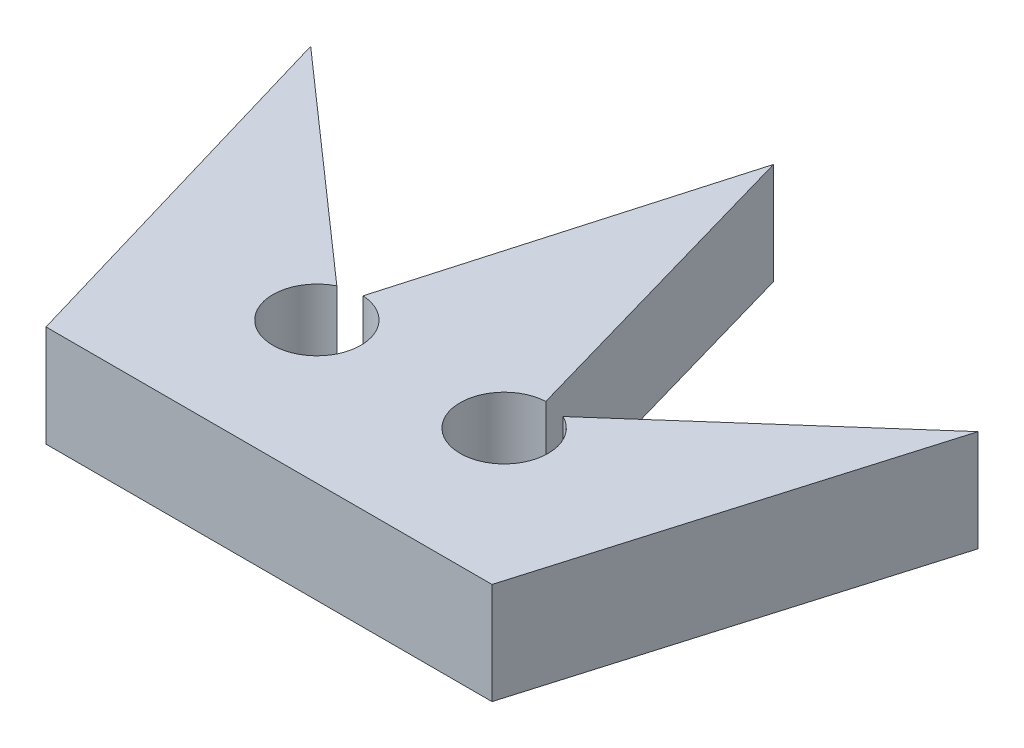
ISO-10303-21;
HEADER;
FILE_DESCRIPTION(('STEP AP214'),'2;1');
FILE_NAME('part.step','',(''),(''),'','','');
FILE_SCHEMA(('AUTOMOTIVE_DESIGN { 1 0 10303 214 1 1 1 1 }'));
ENDSEC;
DATA;
#1=APPLICATION_CONTEXT('core data for automotive mechanical design processes');
#2=APPLICATION_PROTOCOL_DEFINITION('international standard','automotive_design',2000,#1);
#3=PRODUCT_CONTEXT('',#1,'mechanical');
#4=PRODUCT('Part','Part','',(#3));
#5=PRODUCT_RELATED_PRODUCT_CATEGORY('part','',(#4));
#6=PRODUCT_DEFINITION_FORMATION('','',#4);
#7=PRODUCT_DEFINITION_CONTEXT('part definition',#1,'design');
#8=PRODUCT_DEFINITION('design','',#6,#7);
#9=PRODUCT_DEFINITION_SHAPE('','',#8);
#10=(LENGTH_UNIT() NAMED_UNIT(*) SI_UNIT(.MILLI.,.METRE.));
#11=(NAMED_UNIT(*) PLANE_ANGLE_UNIT() SI_UNIT($,.RADIAN.));
#12=(NAMED_UNIT(*) SI_UNIT($,.STERADIAN.) SOLID_ANGLE_UNIT());
#13=UNCERTAINTY_MEASURE_WITH_UNIT(LENGTH_MEASURE(1.E-05),#10,'distance_accuracy_value','');
#14=(GEOMETRIC_REPRESENTATION_CONTEXT(3) GLOBAL_UNCERTAINTY_ASSIGNED_CONTEXT((#13)) GLOBAL_UNIT_ASSIGNED_CONTEXT((#10,
#11,#12)) REPRESENTATION_CONTEXT('',''));
#15=CARTESIAN_POINT('',(0.,0.,0.));
#16=DIRECTION('',(0.,0.,1.));
#17=DIRECTION('',(1.,0.,0.));
#18=AXIS2_PLACEMENT_3D('',#15,#16,#17);
#19=CARTESIAN_POINT('',(-41.4211907266411,17.145,42.8132028356834));
#20=DIRECTION('',(0.959182747675302,0.,-0.28278694552977));
#21=DIRECTION('',(-0.282786945529771,0.,-0.959182747675302));
#22=AXIS2_PLACEMENT_3D('',#19,#20,#21);
#23=PLANE('',#22);
#24=DIRECTION('',(0.282786945529771,0.,0.959182747675302));
#25=VECTOR('',#24,1.);
#26=CARTESIAN_POINT('',(-41.4211907266411,-3.429,42.8132028356834));
#27=LINE('',#26,#25);
#28=CARTESIAN_POINT('',(-63.8484997023004,-3.429,-33.2578046358095));
#29=VERTEX_POINT('',#28);
#30=CARTESIAN_POINT('',(-41.4211907266411,-3.429,42.8132028356834));
#31=VERTEX_POINT('',#30);
#32=EDGE_CURVE('E152',#29,#31,#27,.T.);
#33=ORIENTED_EDGE('',*,*,#32,.T.);
#34=DIRECTION('',(0.,-1.,0.));
#35=VECTOR('',#34,1.);
#36=CARTESIAN_POINT('',(-41.4211907266411,17.145,42.8132028356834));
#37=LINE('',#36,#35);
#38=CARTESIAN_POINT('',(-41.4211907266411,17.145,42.8132028356834));
#39=VERTEX_POINT('',#38);
#40=EDGE_CURVE('E12',#39,#31,#37,.T.);
#41=ORIENTED_EDGE('',*,*,#40,.F.);
#42=DIRECTION('',(0.282786945529771,0.,0.959182747675302));
#43=VECTOR('',#42,1.);
#44=CARTESIAN_POINT('',(-41.4211907266411,17.145,42.8132028356834));
#45=LINE('',#44,#43);
#46=CARTESIAN_POINT('',(-63.8484997023004,17.145,-33.2578046358095));
#47=VERTEX_POINT('',#46);
#48=EDGE_CURVE('E177',#47,#39,#45,.T.);
#49=ORIENTED_EDGE('',*,*,#48,.F.);
#50=DIRECTION('',(0.,-1.,0.));
#51=VECTOR('',#50,1.);
#52=CARTESIAN_POINT('',(-63.8484997023004,17.145,-33.2578046358095));
#53=LINE('',#52,#51);
#54=EDGE_CURVE('E148',#47,#29,#53,.T.);
#55=ORIENTED_EDGE('',*,*,#54,.T.);
#56=EDGE_LOOP('',(#33,#41,#49,#55));
#57=FACE_BOUND('',#56,.T.);
#58=ADVANCED_FACE('F45',(#57),#23,.F.);
#59=CARTESIAN_POINT('',(48.9780188827693,17.145,42.8132028356834));
#60=DIRECTION('',(0.,0.,-1.));
#61=DIRECTION('',(-1.,0.,0.));
#62=AXIS2_PLACEMENT_3D('',#59,#60,#61);
#63=PLANE('',#62);
#64=DIRECTION('',(1.,0.,0.));
#65=VECTOR('',#64,1.);
#66=CARTESIAN_POINT('',(48.9780188827693,-3.429,42.8132028356834));
#67=LINE('',#66,#65);
#68=CARTESIAN_POINT('',(48.9780188827693,-3.429,42.8132028356834));
#69=VERTEX_POINT('',#68);
#70=EDGE_CURVE('E156',#31,#69,#67,.T.);
#71=ORIENTED_EDGE('',*,*,#70,.T.);
#72=DIRECTION('',(0.,-1.,0.));
#73=VECTOR('',#72,1.);
#74=CARTESIAN_POINT('',(48.9780188827693,17.145,42.8132028356834));
#75=LINE('',#74,#73);
#76=CARTESIAN_POINT('',(48.9780188827693,17.145,42.8132028356834));
#77=VERTEX_POINT('',#76);
#78=EDGE_CURVE('E54',#77,#69,#75,.T.);
#79=ORIENTED_EDGE('',*,*,#78,.F.);
#80=DIRECTION('',(1.,0.,0.));
#81=VECTOR('',#80,1.);
#82=CARTESIAN_POINT('',(48.9780188827693,17.145,42.8132028356834));
#83=LINE('',#82,#81);
#84=EDGE_CURVE('E108',#39,#77,#83,.T.);
#85=ORIENTED_EDGE('',*,*,#84,.F.);
#86=ORIENTED_EDGE('',*,*,#40,.T.);
#87=EDGE_LOOP('',(#71,#79,#85,#86));
#88=FACE_BOUND('',#87,.T.);
#89=ADVANCED_FACE('F233',(#88),#63,.F.);
#90=CARTESIAN_POINT('',(48.9780188827693,17.145,42.8132028356834));
#91=DIRECTION('',(-0.959182747675302,0.,-0.28278694552977));
#92=DIRECTION('',(-0.282786945529771,0.,0.959182747675302));
#93=AXIS2_PLACEMENT_3D('',#90,#91,#92);
#94=PLANE('',#93);
#95=DIRECTION('',(0.282786945529771,0.,-0.959182747675302));
#96=VECTOR('',#95,1.);
#97=CARTESIAN_POINT('',(48.9780188827693,-3.429,42.8132028356834));
#98=LINE('',#97,#96);
#99=CARTESIAN_POINT('',(71.4053278584285,-3.429,-33.2578046358095));
#100=VERTEX_POINT('',#99);
#101=EDGE_CURVE('E159',#69,#100,#98,.T.);
#102=ORIENTED_EDGE('',*,*,#101,.T.);
#103=DIRECTION('',(0.,-1.,0.));
#104=VECTOR('',#103,1.);
#105=CARTESIAN_POINT('',(71.4053278584285,17.145,-33.2578046358095));
#106=LINE('',#105,#104);
#107=CARTESIAN_POINT('',(71.4053278584285,17.145,-33.2578046358095));
#108=VERTEX_POINT('',#107);
#109=EDGE_CURVE('E192',#108,#100,#106,.T.);
#110=ORIENTED_EDGE('',*,*,#109,.F.);
#111=DIRECTION('',(0.282786945529771,0.,-0.959182747675302));
#112=VECTOR('',#111,1.);
#113=CARTESIAN_POINT('',(48.9780188827693,17.145,42.8132028356834));
#114=LINE('',#113,#112);
#115=EDGE_CURVE('E202',#77,#108,#114,.T.);
#116=ORIENTED_EDGE('',*,*,#115,.F.);
#117=ORIENTED_EDGE('',*,*,#78,.T.);
#118=EDGE_LOOP('',(#102,#110,#116,#117));
#119=FACE_BOUND('',#118,.T.);
#120=ADVANCED_FACE('F200',(#119),#94,.F.);
#121=CARTESIAN_POINT('',(71.4053278584285,17.145,-33.2578046358095));
#122=DIRECTION('',(0.661200984662022,0.,0.750208809520371));
#123=DIRECTION('',(0.750208809520371,0.,-0.661200984662022));
#124=AXIS2_PLACEMENT_3D('',#121,#122,#123);
#125=PLANE('',#124);
#126=DIRECTION('',(-0.750208809520371,0.,0.661200984662022));
#127=VECTOR('',#126,1.);
#128=CARTESIAN_POINT('',(71.4053278584285,-3.429,-33.2578046358095));
#129=LINE('',#128,#127);
#130=CARTESIAN_POINT('',(26.7022457785671,-3.429,6.14152194305134));
#131=VERTEX_POINT('',#130);
#132=EDGE_CURVE('E162',#100,#131,#129,.T.);
#133=ORIENTED_EDGE('',*,*,#132,.T.);
#134=DIRECTION('',(0.,-1.,0.));
#135=VECTOR('',#134,1.);
#136=CARTESIAN_POINT('',(26.7022457785671,17.145,6.14152194305134));
#137=LINE('',#136,#135);
#138=CARTESIAN_POINT('',(26.7022457785671,17.145,6.14152194305134));
#139=VERTEX_POINT('',#138);
#140=EDGE_CURVE('E188',#139,#131,#137,.T.);
#141=ORIENTED_EDGE('',*,*,#140,.F.);
#142=DIRECTION('',(-0.750208809520371,0.,0.661200984662022));
#143=VECTOR('',#142,1.);
#144=CARTESIAN_POINT('',(71.4053278584285,17.145,-33.2578046358095));
#145=LINE('',#144,#143);
#146=EDGE_CURVE('E219',#108,#139,#145,.T.);
#147=ORIENTED_EDGE('',*,*,#146,.F.);
#148=ORIENTED_EDGE('',*,*,#109,.T.);
#149=EDGE_LOOP('',(#133,#141,#147,#148));
#150=FACE_BOUND('',#149,.T.);
#151=ADVANCED_FACE('F211',(#150),#125,.F.);
#152=CARTESIAN_POINT('',(22.7567526148682,17.145,14.1366589619358));
#153=DIRECTION('',(0.,-1.,0.));
#154=DIRECTION('',(0.,0.,-1.));
#155=AXIS2_PLACEMENT_3D('',#152,#153,#154);
#156=CYLINDRICAL_SURFACE('',#155,8.91566779638697);
#157=CARTESIAN_POINT('',(22.7567526148682,-3.429,14.1366589619358));
#158=DIRECTION('',(0.,-1.,0.));
#159=DIRECTION('',(0.,0.,-1.));
#160=AXIS2_PLACEMENT_3D('',#157,#158,#159);
#161=CIRCLE('',#160,8.91566779638697);
#162=CARTESIAN_POINT('',(22.3077055063096,-3.429,5.23230671430839));
#163=VERTEX_POINT('',#162);
#164=EDGE_CURVE('E165',#131,#163,#161,.T.);
#165=ORIENTED_EDGE('',*,*,#164,.T.);
#166=DIRECTION('',(0.,-1.,0.));
#167=VECTOR('',#166,1.);
#168=CARTESIAN_POINT('',(22.3077055063096,17.145,5.23230671430839));
#169=LINE('',#168,#167);
#170=CARTESIAN_POINT('',(22.3077055063096,17.145,5.23230671430839));
#171=VERTEX_POINT('',#170);
#172=EDGE_CURVE('E184',#171,#163,#169,.T.);
#173=ORIENTED_EDGE('',*,*,#172,.F.);
#174=CARTESIAN_POINT('',(22.7567526148682,17.145,14.1366589619358));
#175=DIRECTION('',(0.,-1.,0.));
#176=DIRECTION('',(0.,0.,-1.));
#177=AXIS2_PLACEMENT_3D('',#174,#175,#176);
#178=CIRCLE('',#177,8.91566779638697);
#179=EDGE_CURVE('E217',#139,#171,#178,.T.);
#180=ORIENTED_EDGE('',*,*,#179,.F.);
#181=ORIENTED_EDGE('',*,*,#140,.T.);
#182=EDGE_LOOP('',(#165,#173,#180,#181));
#183=FACE_BOUND('',#182,.T.);
#184=ADVANCED_FACE('F215',(#183),#156,.F.);
#185=CARTESIAN_POINT('',(22.3077055063096,17.145,5.23230671430839));
#186=DIRECTION('',(-0.961322281418881,0.,0.275425981431667));
#187=DIRECTION('',(0.275425981431667,0.,0.961322281418882));
#188=AXIS2_PLACEMENT_3D('',#185,#186,#187);
#189=PLANE('',#188);
#190=DIRECTION('',(-0.275425981431667,0.,-0.961322281418881));
#191=VECTOR('',#190,1.);
#192=CARTESIAN_POINT('',(22.3077055063096,-3.429,5.23230671430839));
#193=LINE('',#192,#191);
#194=CARTESIAN_POINT('',(3.77841407806406,-3.429,-59.4406795315284));
#195=VERTEX_POINT('',#194);
#196=EDGE_CURVE('E168',#163,#195,#193,.T.);
#197=ORIENTED_EDGE('',*,*,#196,.T.);
#198=DIRECTION('',(0.,-1.,0.));
#199=VECTOR('',#198,1.);
#200=CARTESIAN_POINT('',(3.77841407806406,17.145,-59.4406795315284));
#201=LINE('',#200,#199);
#202=CARTESIAN_POINT('',(3.77841407806406,17.145,-59.4406795315284));
#203=VERTEX_POINT('',#202);
#204=EDGE_CURVE('E141',#203,#195,#201,.T.);
#205=ORIENTED_EDGE('',*,*,#204,.F.);
#206=DIRECTION('',(-0.275425981431667,0.,-0.961322281418881));
#207=VECTOR('',#206,1.);
#208=CARTESIAN_POINT('',(22.3077055063096,17.145,5.23230671430839));
#209=LINE('',#208,#207);
#210=EDGE_CURVE('E130',#171,#203,#209,.T.);
#211=ORIENTED_EDGE('',*,*,#210,.F.);
#212=ORIENTED_EDGE('',*,*,#172,.T.);
#213=EDGE_LOOP('',(#197,#205,#211,#212));
#214=FACE_BOUND('',#213,.T.);
#215=ADVANCED_FACE('F245',(#214),#189,.F.);
#216=CARTESIAN_POINT('',(-14.7508773501815,17.145,5.23230671430839));
#217=DIRECTION('',(0.961322281418881,0.,0.275425981431667));
#218=DIRECTION('',(0.275425981431667,0.,-0.961322281418882));
#219=AXIS2_PLACEMENT_3D('',#216,#217,#218);
#220=PLANE('',#219);
#221=DIRECTION('',(-0.275425981431667,0.,0.961322281418881));
#222=VECTOR('',#221,1.);
#223=CARTESIAN_POINT('',(-14.7508773501815,-3.429,5.23230671430839));
#224=LINE('',#223,#222);
#225=CARTESIAN_POINT('',(-14.7508773501815,-3.429,5.23230671430839));
#226=VERTEX_POINT('',#225);
#227=EDGE_CURVE('E139',#195,#226,#224,.T.);
#228=ORIENTED_EDGE('',*,*,#227,.T.);
#229=DIRECTION('',(0.,-1.,0.));
#230=VECTOR('',#229,1.);
#231=CARTESIAN_POINT('',(-14.7508773501815,17.145,5.23230671430839));
#232=LINE('',#231,#230);
#233=CARTESIAN_POINT('',(-14.7508773501815,17.145,5.23230671430839));
#234=VERTEX_POINT('',#233);
#235=EDGE_CURVE('E136',#234,#226,#232,.T.);
#236=ORIENTED_EDGE('',*,*,#235,.F.);
#237=DIRECTION('',(-0.275425981431667,0.,0.961322281418881));
#238=VECTOR('',#237,1.);
#239=CARTESIAN_POINT('',(-14.7508773501815,17.145,5.23230671430839));
#240=LINE('',#239,#238);
#241=EDGE_CURVE('E124',#203,#234,#240,.T.);
#242=ORIENTED_EDGE('',*,*,#241,.F.);
#243=ORIENTED_EDGE('',*,*,#204,.T.);
#244=EDGE_LOOP('',(#228,#236,#242,#243));
#245=FACE_BOUND('',#244,.T.);
#246=ADVANCED_FACE('F137',(#245),#220,.F.);
#247=CARTESIAN_POINT('',(-15.19992445874,17.145,14.1366589619358));
#248=DIRECTION('',(0.,-1.,0.));
#249=DIRECTION('',(0.,0.,-1.));
#250=AXIS2_PLACEMENT_3D('',#247,#248,#249);
#251=CYLINDRICAL_SURFACE('',#250,8.91566779638697);
#252=CARTESIAN_POINT('',(-15.19992445874,-3.429,14.1366589619358));
#253=DIRECTION('',(0.,-1.,0.));
#254=DIRECTION('',(0.,0.,1.));
#255=AXIS2_PLACEMENT_3D('',#252,#253,#254);
#256=CIRCLE('',#255,8.91566779638697);
#257=CARTESIAN_POINT('',(-19.145417622439,-3.429,6.14152194305134));
#258=VERTEX_POINT('',#257);
#259=EDGE_CURVE('E94',#226,#258,#256,.T.);
#260=ORIENTED_EDGE('',*,*,#259,.T.);
#261=DIRECTION('',(0.,-1.,0.));
#262=VECTOR('',#261,1.);
#263=CARTESIAN_POINT('',(-19.145417622439,17.145,6.14152194305134));
#264=LINE('',#263,#262);
#265=CARTESIAN_POINT('',(-19.145417622439,17.145,6.14152194305134));
#266=VERTEX_POINT('',#265);
#267=EDGE_CURVE('E142',#266,#258,#264,.T.);
#268=ORIENTED_EDGE('',*,*,#267,.F.);
#269=CARTESIAN_POINT('',(-15.19992445874,17.145,14.1366589619358));
#270=DIRECTION('',(0.,-1.,0.));
#271=DIRECTION('',(0.,0.,1.));
#272=AXIS2_PLACEMENT_3D('',#269,#270,#271);
#273=CIRCLE('',#272,8.91566779638697);
#274=EDGE_CURVE('E128',#234,#266,#273,.T.);
#275=ORIENTED_EDGE('',*,*,#274,.F.);
#276=ORIENTED_EDGE('',*,*,#235,.T.);
#277=EDGE_LOOP('',(#260,#268,#275,#276));
#278=FACE_BOUND('',#277,.T.);
#279=ADVANCED_FACE('F144',(#278),#251,.F.);
#280=CARTESIAN_POINT('',(-63.8484997023004,17.145,-33.2578046358095));
#281=DIRECTION('',(-0.661200984662022,0.,0.750208809520371));
#282=DIRECTION('',(0.750208809520371,0.,0.661200984662022));
#283=AXIS2_PLACEMENT_3D('',#280,#281,#282);
#284=PLANE('',#283);
#285=DIRECTION('',(-0.750208809520371,0.,-0.661200984662022));
#286=VECTOR('',#285,1.);
#287=CARTESIAN_POINT('',(-63.8484997023004,-3.429,-33.2578046358095));
#288=LINE('',#287,#286);
#289=EDGE_CURVE('E100',#258,#29,#288,.T.);
#290=ORIENTED_EDGE('',*,*,#289,.T.);
#291=ORIENTED_EDGE('',*,*,#54,.F.);
#292=DIRECTION('',(-0.750208809520371,0.,-0.661200984662022));
#293=VECTOR('',#292,1.);
#294=CARTESIAN_POINT('',(-63.8484997023004,17.145,-33.2578046358095));
#295=LINE('',#294,#293);
#296=EDGE_CURVE('E62',#266,#47,#295,.T.);
#297=ORIENTED_EDGE('',*,*,#296,.F.);
#298=ORIENTED_EDGE('',*,*,#267,.T.);
#299=EDGE_LOOP('',(#290,#291,#297,#298));
#300=FACE_BOUND('',#299,.T.);
#301=ADVANCED_FACE('F253',(#300),#284,.F.);
#302=CARTESIAN_POINT('',(-15.19992445874,17.145,14.1366589619358));
#303=DIRECTION('',(0.,1.,0.));
#304=DIRECTION('',(0.,0.,1.));
#305=AXIS2_PLACEMENT_3D('',#302,#303,#304);
#306=PLANE('',#305);
#307=ORIENTED_EDGE('',*,*,#48,.T.);
#308=ORIENTED_EDGE('',*,*,#84,.T.);
#309=ORIENTED_EDGE('',*,*,#115,.T.);
#310=ORIENTED_EDGE('',*,*,#146,.T.);
#311=ORIENTED_EDGE('',*,*,#179,.T.);
#312=ORIENTED_EDGE('',*,*,#210,.T.);
#313=ORIENTED_EDGE('',*,*,#241,.T.);
#314=ORIENTED_EDGE('',*,*,#274,.T.);
#315=ORIENTED_EDGE('',*,*,#296,.T.);
#316=EDGE_LOOP('',(#307,#308,#309,#310,#311,#312,#313,#314,#315));
#317=FACE_BOUND('',#316,.T.);
#318=ADVANCED_FACE('F126',(#317),#306,.T.);
#319=CARTESIAN_POINT('',(-15.19992445874,-3.429,14.1366589619358));
#320=DIRECTION('',(0.,1.,0.));
#321=DIRECTION('',(0.,0.,1.));
#322=AXIS2_PLACEMENT_3D('',#319,#320,#321);
#323=PLANE('',#322);
#324=ORIENTED_EDGE('',*,*,#32,.F.);
#325=ORIENTED_EDGE('',*,*,#289,.F.);
#326=ORIENTED_EDGE('',*,*,#259,.F.);
#327=ORIENTED_EDGE('',*,*,#227,.F.);
#328=ORIENTED_EDGE('',*,*,#196,.F.);
#329=ORIENTED_EDGE('',*,*,#164,.F.);
#330=ORIENTED_EDGE('',*,*,#132,.F.);
#331=ORIENTED_EDGE('',*,*,#101,.F.);
#332=ORIENTED_EDGE('',*,*,#70,.F.);
#333=EDGE_LOOP('',(#324,#325,#326,#327,#328,#329,#330,#331,#332));
#334=FACE_BOUND('',#333,.T.);
#335=ADVANCED_FACE('F206',(#334),#323,.F.);
#336=CLOSED_SHELL('',(#58,#89,#120,#151,#184,#215,#246,#279,#301,#318,#335));
#337=MANIFOLD_SOLID_BREP('B2',#336);
#338=ADVANCED_BREP_SHAPE_REPRESENTATION('',(#18,#337),#14);
#339=SHAPE_DEFINITION_REPRESENTATION(#9,#338);
ENDSEC;
END-ISO-10303-21;
